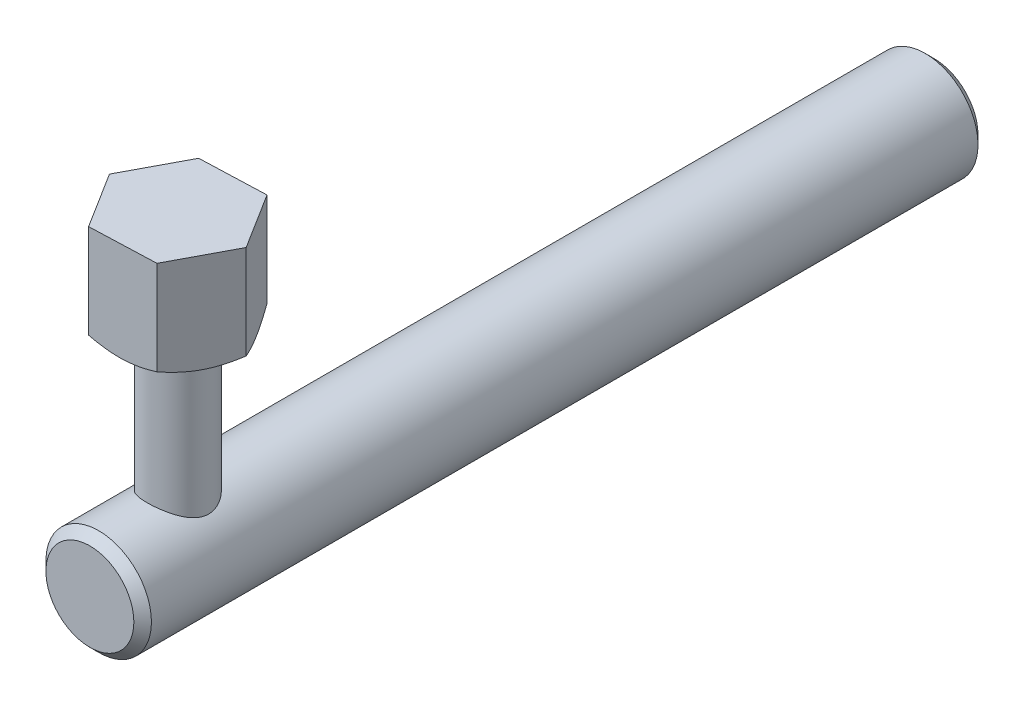
ISO-10303-21;
HEADER;
FILE_DESCRIPTION(('STEP AP214'),'2;1');
FILE_NAME('part.step','',(''),(''),'','','');
FILE_SCHEMA(('AUTOMOTIVE_DESIGN { 1 0 10303 214 1 1 1 1 }'));
ENDSEC;
DATA;
#1=APPLICATION_CONTEXT('core data for automotive mechanical design processes');
#2=APPLICATION_PROTOCOL_DEFINITION('international standard','automotive_design',2000,#1);
#3=PRODUCT_CONTEXT('',#1,'mechanical');
#4=PRODUCT('Part','Part','',(#3));
#5=PRODUCT_RELATED_PRODUCT_CATEGORY('part','',(#4));
#6=PRODUCT_DEFINITION_FORMATION('','',#4);
#7=PRODUCT_DEFINITION_CONTEXT('part definition',#1,'design');
#8=PRODUCT_DEFINITION('design','',#6,#7);
#9=PRODUCT_DEFINITION_SHAPE('','',#8);
#10=(LENGTH_UNIT() NAMED_UNIT(*) SI_UNIT(.MILLI.,.METRE.));
#11=(NAMED_UNIT(*) PLANE_ANGLE_UNIT() SI_UNIT($,.RADIAN.));
#12=(NAMED_UNIT(*) SI_UNIT($,.STERADIAN.) SOLID_ANGLE_UNIT());
#13=UNCERTAINTY_MEASURE_WITH_UNIT(LENGTH_MEASURE(1.E-05),#10,'distance_accuracy_value','');
#14=(GEOMETRIC_REPRESENTATION_CONTEXT(3) GLOBAL_UNCERTAINTY_ASSIGNED_CONTEXT((#13)) GLOBAL_UNIT_ASSIGNED_CONTEXT((#10,
#11,#12)) REPRESENTATION_CONTEXT('',''));
#15=CARTESIAN_POINT('',(0.,0.,0.));
#16=DIRECTION('',(0.,0.,1.));
#17=DIRECTION('',(1.,0.,0.));
#18=AXIS2_PLACEMENT_3D('',#15,#16,#17);
#19=CARTESIAN_POINT('',(0.,0.,48.));
#20=DIRECTION('',(0.,0.,-1.));
#21=DIRECTION('',(-1.,0.,0.));
#22=AXIS2_PLACEMENT_3D('',#19,#20,#21);
#23=CYLINDRICAL_SURFACE('',#22,3.);
#24=CARTESIAN_POINT('',(0.,0.,0.500000000000007));
#25=DIRECTION('',(0.,0.,1.));
#26=DIRECTION('',(1.,0.,0.));
#27=AXIS2_PLACEMENT_3D('',#24,#25,#26);
#28=CIRCLE('',#27,3.);
#29=CARTESIAN_POINT('',(3.,0.,0.500000000000007));
#30=VERTEX_POINT('',#29);
#31=EDGE_CURVE('E158',#30,#30,#28,.T.);
#32=ORIENTED_EDGE('',*,*,#31,.T.);
#33=EDGE_LOOP('',(#32));
#34=FACE_BOUND('',#33,.T.);
#35=CARTESIAN_POINT('',(0.,0.,47.5));
#36=DIRECTION('',(0.,0.,1.));
#37=DIRECTION('',(1.,0.,0.));
#38=AXIS2_PLACEMENT_3D('',#35,#36,#37);
#39=CIRCLE('',#38,3.);
#40=CARTESIAN_POINT('',(3.,0.,47.5));
#41=VERTEX_POINT('',#40);
#42=EDGE_CURVE('E90',#41,#41,#39,.F.);
#43=ORIENTED_EDGE('',*,*,#42,.T.);
#44=EDGE_LOOP('',(#43));
#45=FACE_BOUND('',#44,.T.);
#46=CARTESIAN_POINT('',(0.,3.,41.25));
#47=CARTESIAN_POINT('',(-0.0899260943450845,2.99999338722546,41.2500075102751));
#48=CARTESIAN_POINT('',(-0.179998893749567,2.99591170123809,41.2569801261747));
#49=CARTESIAN_POINT('',(-0.357477608462208,2.97996641346643,41.2845347706795));
#50=CARTESIAN_POINT('',(-0.444875348469012,2.96808104977951,41.3051548589132));
#51=CARTESIAN_POINT('',(-0.614025151526458,2.93774064644758,41.3588700314015));
#52=CARTESIAN_POINT('',(-0.695802763517555,2.91931806060852,41.3919035366462));
#53=CARTESIAN_POINT('',(-0.852413327579683,2.87749372937535,41.4691433051688));
#54=CARTESIAN_POINT('',(-0.927248639202856,2.85409368469238,41.5133457531799));
#55=CARTESIAN_POINT('',(-1.07412994865769,2.80227568751607,41.6153261901825));
#56=CARTESIAN_POINT('',(-1.14555876319282,2.7736144392163,41.6738672112658));
#57=CARTESIAN_POINT('',(-1.2781872761086,2.71505162558485,41.8011664198337));
#58=CARTESIAN_POINT('',(-1.33937410327363,2.68514855764821,41.869937261385));
#59=CARTESIAN_POINT('',(-1.45686356139007,2.62343929807139,42.0250291391928));
#60=CARTESIAN_POINT('',(-1.51180708165682,2.59180663266207,42.1124578489916));
#61=CARTESIAN_POINT('',(-1.60599469056331,2.53452851602359,42.2971609938009));
#62=CARTESIAN_POINT('',(-1.64526337520153,2.50887371124403,42.3944197012085));
#63=CARTESIAN_POINT('',(-1.69909798826494,2.4726236141756,42.5731886725813));
#64=CARTESIAN_POINT('',(-1.71726593207437,2.45992290524076,42.6531861262229));
#65=CARTESIAN_POINT('',(-1.74220880806771,2.44232499742875,42.8157446129059));
#66=CARTESIAN_POINT('',(-1.74899672707175,2.4374189037159,42.8983026140835));
#67=CARTESIAN_POINT('',(-1.75079751335569,2.43612603576165,43.0637461686225));
#68=CARTESIAN_POINT('',(-1.74579159193087,2.43975285524638,43.1466320343467));
#69=CARTESIAN_POINT('',(-1.72427221835426,2.4550052736622,43.3101580332378));
#70=CARTESIAN_POINT('',(-1.70775053579179,2.46663659340118,43.390796517287));
#71=CARTESIAN_POINT('',(-1.66420416251994,2.49621759524857,43.5472449281548));
#72=CARTESIAN_POINT('',(-1.63725766204425,2.51412014830033,43.6230860226689));
#73=CARTESIAN_POINT('',(-1.57381751458139,2.55431118840021,43.7693924210053));
#74=CARTESIAN_POINT('',(-1.53732027653726,2.57660132438734,43.8398556898772));
#75=CARTESIAN_POINT('',(-1.44880386712598,2.62754339459873,43.9858591479175));
#76=CARTESIAN_POINT('',(-1.39521241489436,2.65663674082645,44.0602930726072));
#77=CARTESIAN_POINT('',(-1.27719426081561,2.71535009643278,44.1998490854684));
#78=CARTESIAN_POINT('',(-1.21275783328052,2.74497055700983,44.2649627174144));
#79=CARTESIAN_POINT('',(-1.06533337749026,2.80573975117747,44.3921838607443));
#80=CARTESIAN_POINT('',(-0.981035653023088,2.83662238285853,44.4529168874777));
#81=CARTESIAN_POINT('',(-0.801536482279148,2.89246450838123,44.5591316856122));
#82=CARTESIAN_POINT('',(-0.706341603399296,2.91742754221545,44.6046225787535));
#83=CARTESIAN_POINT('',(-0.514251102271482,2.9571107689339,44.6756525193109));
#84=CARTESIAN_POINT('',(-0.417897866948717,2.97240570101994,44.7023251922613));
#85=CARTESIAN_POINT('',(-0.221075458285349,2.99347337655184,44.7388538422154));
#86=CARTESIAN_POINT('',(-0.12061080958467,2.99925631377851,44.7487278223727));
#87=CARTESIAN_POINT('',(0.067717403990929,3.00052359526908,44.7508952195566));
#88=CARTESIAN_POINT('',(0.155557082863695,2.99722519897386,44.7452665679397));
#89=CARTESIAN_POINT('',(0.328810809400083,2.98319182205348,44.7210553653368));
#90=CARTESIAN_POINT('',(0.41422484902943,2.97245681679956,44.7024727714496));
#91=CARTESIAN_POINT('',(0.579031092089089,2.94475908509854,44.6536327433821));
#92=CARTESIAN_POINT('',(0.658496978005276,2.92789716062394,44.6235638954467));
#93=CARTESIAN_POINT('',(0.811280788568504,2.88929746572665,44.5528733099519));
#94=CARTESIAN_POINT('',(0.884597345554283,2.86755861456527,44.5122492330122));
#95=CARTESIAN_POINT('',(1.03125054777328,2.81835251812347,44.4168466193152));
#96=CARTESIAN_POINT('',(1.1037917379709,2.79052428902397,44.361033709639));
#97=CARTESIAN_POINT('',(1.23903994969308,2.73316466994081,44.2391854559716));
#98=CARTESIAN_POINT('',(1.30173536781871,2.70363132566081,44.1731382300313));
#99=CARTESIAN_POINT('',(1.42318031383413,2.64191747712639,44.0234394393859));
#100=CARTESIAN_POINT('',(1.4805627405233,2.6098424416357,43.9386273020232));
#101=CARTESIAN_POINT('',(1.58019412669645,2.55075513818308,43.7589496391092));
#102=CARTESIAN_POINT('',(1.62246174572416,2.52373664759979,43.6640966980315));
#103=CARTESIAN_POINT('',(1.68265714440949,2.48388372009225,43.4877261025337));
#104=CARTESIAN_POINT('',(1.70386706375961,2.46924743843143,43.4077388924777));
#105=CARTESIAN_POINT('',(1.73480246090685,2.44761658997012,43.2446045317072));
#106=CARTESIAN_POINT('',(1.74454222628975,2.44061251706413,43.1614614456635));
#107=CARTESIAN_POINT('',(1.75199797784208,2.43526756986959,42.9941233924334));
#108=CARTESIAN_POINT('',(1.74968171574835,2.43694993053426,42.9099262056538));
#109=CARTESIAN_POINT('',(1.73309765744759,2.44876883220608,42.7433060808237));
#110=CARTESIAN_POINT('',(1.71882257779048,2.45891052530542,42.6608842554328));
#111=CARTESIAN_POINT('',(1.67969834968853,2.48578933414961,42.5024193598982));
#112=CARTESIAN_POINT('',(1.6551721029676,2.50232397669437,42.4262600387955));
#113=CARTESIAN_POINT('',(1.59654281469426,2.54013079252814,42.2790005665599));
#114=CARTESIAN_POINT('',(1.56243614711979,2.56140475893648,42.2079023437599));
#115=CARTESIAN_POINT('',(1.47952471389623,2.61029903994167,42.0610224449251));
#116=CARTESIAN_POINT('',(1.42926140154465,2.63839194619498,41.9862219348996));
#117=CARTESIAN_POINT('',(1.31811740411898,2.69564120997005,41.8453893283888));
#118=CARTESIAN_POINT('',(1.25722839803791,2.72479838666695,41.7793641758257));
#119=CARTESIAN_POINT('',(1.11644726620308,2.78571532241789,41.6485122738925));
#120=CARTESIAN_POINT('',(1.03508780981761,2.81726705078823,41.5851506195222));
#121=CARTESIAN_POINT('',(0.861137847178947,2.87521292497644,41.4730254125696));
#122=CARTESIAN_POINT('',(0.768544713403451,2.9016058603848,41.4242652845244));
#123=CARTESIAN_POINT('',(0.578904287064569,2.94513750992323,41.3455009884513));
#124=CARTESIAN_POINT('',(0.482276584546067,2.9626557940663,41.3147168828241));
#125=CARTESIAN_POINT('',(0.333826312006086,2.98178935898444,41.2813839255705));
#126=CARTESIAN_POINT('',(0.28381647122351,2.98697473272503,41.272416377112));
#127=CARTESIAN_POINT('',(0.183023149242705,2.99483609603923,41.2588575187579));
#128=CARTESIAN_POINT('',(0.132240341083978,2.99751415451088,41.2542626007576));
#129=CARTESIAN_POINT('',(0.0542562694068423,2.99963295339894,41.2506296437925));
#130=CARTESIAN_POINT('',(0.0271348134861308,3.00000199537637,41.2499977338067));
#131=CARTESIAN_POINT('',(0.,3.,41.25));
#132=B_SPLINE_CURVE_WITH_KNOTS('',3,(#46,#47,#48,#49,#50,#51,#52,#53,#54,#55,#56,#57,#58,#59,
#60,#61,#62,#63,#64,#65,#66,#67,#68,#69,#70,#71,#72,#73,#74,#75,#76,#77,#78,#79,#80,#81,#82,#83,
#84,#85,#86,#87,#88,#89,#90,#91,#92,#93,#94,#95,#96,#97,#98,#99,#100,#101,#102,#103,#104,#105,
#106,#107,#108,#109,#110,#111,#112,#113,#114,#115,#116,#117,#118,#119,#120,#121,#122,#123,#124,
#125,#126,#127,#128,#129,#130,#131),.UNSPECIFIED.,.T.,.F.,(4,2,2,2,2,2,2,2,2,2,2,2,2,2,2,2,2,2,
2,2,2,2,2,2,2,2,2,2,2,2,2,2,2,2,2,2,2,2,2,2,2,2,4),(0.,0.269682848507375,0.540120966746718,
0.809234867445783,1.07825696388483,1.36720562389127,1.65651472601918,1.97891442487773,
2.30080622610211,2.54877444581718,2.79645949249157,3.04453939165373,3.29279677764287,
3.53922714819382,3.78575030950587,4.07329505075291,4.36109904743875,4.6845988301423,
5.00790466534685,5.30952425878853,5.61082040251298,5.87376281934726,6.13670610700591,
6.39550593899182,6.65436317839365,6.94021883480414,7.22640888861097,7.54680260063234,
7.86679940325803,8.11784613873921,8.36857983060696,8.61998454570948,8.87154248884005,
9.11571156496426,9.35997317962995,9.64208079618314,9.92441033147709,10.246312237478,
10.5682895810184,10.8749947772205,11.0280026433255,11.1808841442313,11.26225978773),.UNSPECIFIED.);
#133=CARTESIAN_POINT('',(0.,3.,41.25));
#134=VERTEX_POINT('',#133);
#135=EDGE_CURVE('E91',#134,#134,#132,.T.);
#136=ORIENTED_EDGE('',*,*,#135,.F.);
#137=EDGE_LOOP('',(#136));
#138=FACE_BOUND('',#137,.T.);
#139=ADVANCED_FACE('F31',(#34,#45,#138),#23,.T.);
#140=CARTESIAN_POINT('',(0.,0.,48.));
#141=DIRECTION('',(0.,0.,1.));
#142=DIRECTION('',(1.,0.,0.));
#143=AXIS2_PLACEMENT_3D('',#140,#141,#142);
#144=PLANE('',#143);
#145=CARTESIAN_POINT('',(0.,0.,48.));
#146=DIRECTION('',(0.,0.,1.));
#147=DIRECTION('',(1.,0.,0.));
#148=AXIS2_PLACEMENT_3D('',#145,#146,#147);
#149=CIRCLE('',#148,2.50000000000001);
#150=CARTESIAN_POINT('',(2.50000000000001,0.,48.));
#151=VERTEX_POINT('',#150);
#152=EDGE_CURVE('E11',#151,#151,#149,.T.);
#153=ORIENTED_EDGE('',*,*,#152,.T.);
#154=EDGE_LOOP('',(#153));
#155=FACE_BOUND('',#154,.T.);
#156=ADVANCED_FACE('F143',(#155),#144,.T.);
#157=CARTESIAN_POINT('',(0.,0.,0.));
#158=DIRECTION('',(0.,0.,1.));
#159=DIRECTION('',(1.,0.,0.));
#160=AXIS2_PLACEMENT_3D('',#157,#158,#159);
#161=PLANE('',#160);
#162=CARTESIAN_POINT('',(0.,0.,0.));
#163=DIRECTION('',(0.,0.,1.));
#164=DIRECTION('',(1.,0.,0.));
#165=AXIS2_PLACEMENT_3D('',#162,#163,#164);
#166=CIRCLE('',#165,2.5);
#167=CARTESIAN_POINT('',(2.5,0.,0.));
#168=VERTEX_POINT('',#167);
#169=EDGE_CURVE('E39',#168,#168,#166,.F.);
#170=ORIENTED_EDGE('',*,*,#169,.T.);
#171=EDGE_LOOP('',(#170));
#172=FACE_BOUND('',#171,.T.);
#173=ADVANCED_FACE('F138',(#172),#161,.F.);
#174=CARTESIAN_POINT('',(0.,10.,43.));
#175=DIRECTION('',(0.,-1.,0.));
#176=DIRECTION('',(0.,0.,-1.));
#177=AXIS2_PLACEMENT_3D('',#174,#175,#176);
#178=CYLINDRICAL_SURFACE('',#177,1.75);
#179=CARTESIAN_POINT('',(0.,10.,43.));
#180=DIRECTION('',(0.,1.,0.));
#181=DIRECTION('',(0.,0.,1.));
#182=AXIS2_PLACEMENT_3D('',#179,#180,#181);
#183=CIRCLE('',#182,1.75);
#184=CARTESIAN_POINT('',(0.,10.,44.75));
#185=VERTEX_POINT('',#184);
#186=EDGE_CURVE('E102',#185,#185,#183,.T.);
#187=ORIENTED_EDGE('',*,*,#186,.F.);
#188=EDGE_LOOP('',(#187));
#189=FACE_BOUND('',#188,.T.);
#190=ORIENTED_EDGE('',*,*,#135,.T.);
#191=EDGE_LOOP('',(#190));
#192=FACE_BOUND('',#191,.T.);
#193=ADVANCED_FACE('F133',(#189,#192),#178,.T.);
#194=CARTESIAN_POINT('',(0.,10.,43.));
#195=DIRECTION('',(0.,1.,0.));
#196=DIRECTION('',(0.,0.,1.));
#197=AXIS2_PLACEMENT_3D('',#194,#195,#196);
#198=CONICAL_SURFACE('',#197,1.75,1.0471975511966);
#199=ORIENTED_EDGE('',*,*,#186,.T.);
#200=EDGE_LOOP('',(#199));
#201=FACE_BOUND('',#200,.T.);
#202=CARTESIAN_POINT('',(3.7504066221204,11.1563718453863,42.8633637550206));
#203=CARTESIAN_POINT('',(3.66279591393919,11.1087465089926,42.7236440962043));
#204=CARTESIAN_POINT('',(3.57442895604172,11.0654329032158,42.5827183867289));
#205=CARTESIAN_POINT('',(3.39616485296428,10.9898283431835,42.2984266582604));
#206=CARTESIAN_POINT('',(3.3062645401293,10.9575641354304,42.1550555875597));
#207=CARTESIAN_POINT('',(3.12757806752451,10.9073398855258,41.8700902733221));
#208=CARTESIAN_POINT('',(3.03881940187538,10.8890455796959,41.728539876813));
#209=CARTESIAN_POINT('',(2.86088440086257,10.8672054401073,41.4447729931854));
#210=CARTESIAN_POINT('',(2.77170871230497,10.863641521401,41.302557537579));
#211=CARTESIAN_POINT('',(2.60507697513266,10.8710531404543,41.0368168541738));
#212=CARTESIAN_POINT('',(2.52759599059848,10.8802088735679,40.9132518591109));
#213=CARTESIAN_POINT('',(2.37313881298929,10.9092279710964,40.6669268994649));
#214=CARTESIAN_POINT('',(2.29616315420756,10.9291012498247,40.5441677869612));
#215=CARTESIAN_POINT('',(2.14138747903203,10.9787832230896,40.2973348942985));
#216=CARTESIAN_POINT('',(2.06360705337839,11.0088025316205,40.1732923570273));
#217=CARTESIAN_POINT('',(1.90920632288802,11.0769346775788,39.9270574180232));
#218=CARTESIAN_POINT('',(1.83258403973161,11.1150315048238,39.8048618613088));
#219=CARTESIAN_POINT('',(1.75651153283148,11.1563718453863,39.6835430758539));
#220=B_SPLINE_CURVE_WITH_KNOTS('',3,(#202,#203,#204,#205,#206,#207,#208,#209,#210,#211,#212,
#213,#214,#215,#216,#217,#218,#219),.UNSPECIFIED.,.F.,.F.,(4,2,2,2,2,2,2,2,4),(0.,
0.515167182529291,1.03157272281126,1.53519724939805,2.03820327671983,2.47619144736974,
2.91458547765286,3.36270420986569,3.80994290792929),.UNSPECIFIED.);
#221=CARTESIAN_POINT('',(3.75028121284168,11.1563036955848,42.8631637550206));
#222=VERTEX_POINT('',#221);
#223=CARTESIAN_POINT('',(1.75663694211021,11.1563036955848,39.6837430758539));
#224=VERTEX_POINT('',#223);
#225=EDGE_CURVE('E82',#222,#224,#220,.T.);
#226=ORIENTED_EDGE('',*,*,#225,.F.);
#227=CARTESIAN_POINT('',(1.99353832978767,11.1563690332446,46.1796206791667));
#228=CARTESIAN_POINT('',(2.07073367268943,11.1087439278033,46.033887896101));
#229=CARTESIAN_POINT('',(2.14859536074791,11.0654305673381,45.8868971571726));
#230=CARTESIAN_POINT('',(2.30566700564657,10.9898265164491,45.5903703578691));
#231=CARTESIAN_POINT('',(2.38487975351698,10.9575625722074,45.4408290284637));
#232=CARTESIAN_POINT('',(2.54232355169433,10.9073388432448,45.1435996617385));
#233=CARTESIAN_POINT('',(2.62053037676062,10.8890447964349,44.9959573578996));
#234=CARTESIAN_POINT('',(2.77731203399823,10.8672051574843,44.6999780101303));
#235=CARTESIAN_POINT('',(2.85588629627569,10.8636414806077,44.5516420420706));
#236=CARTESIAN_POINT('',(3.00270783970964,10.8710534818906,44.2744658377254));
#237=CARTESIAN_POINT('',(3.07097709474181,10.8802092618219,44.1455841181854));
#238=CARTESIAN_POINT('',(3.20707082912443,10.9092282326162,43.8886603463119));
#239=CARTESIAN_POINT('',(3.27489483772076,10.9291013372889,43.7606191826889));
#240=CARTESIAN_POINT('',(3.41126919248099,10.9787827671983,43.5031656432533));
#241=CARTESIAN_POINT('',(3.47980227747735,11.0088016994371,43.3737858538364));
#242=CARTESIAN_POINT('',(3.61584626693854,11.0769329498279,43.116955992626));
#243=CARTESIAN_POINT('',(3.68335891445489,11.115029258508,42.9895026302229));
#244=CARTESIAN_POINT('',(3.75038715378547,11.1563690332446,42.8629637550206));
#245=B_SPLINE_CURVE_WITH_KNOTS('',3,(#227,#228,#229,#230,#231,#232,#233,#234,#235,#236,#237,
#238,#239,#240,#241,#242,#243,#244),.UNSPECIFIED.,.F.,.F.,(4,2,2,2,2,2,2,2,4),(0.,
0.515166515548207,1.03157137058384,1.53519529391929,2.03820072526884,2.4761845853491,
2.91457428880859,3.36268846522177,3.80992263980002),.UNSPECIFIED.);
#246=CARTESIAN_POINT('',(1.99364427073147,11.1563036955848,46.1794206791667));
#247=VERTEX_POINT('',#246);
#248=EDGE_CURVE('E85',#247,#222,#245,.T.);
#249=ORIENTED_EDGE('',*,*,#248,.F.);
#250=CARTESIAN_POINT('',(-1.75683694211023,11.1563614713408,46.3162642215319));
#251=CARTESIAN_POINT('',(-1.59203142012176,11.1087369869403,46.3102509741244));
#252=CARTESIAN_POINT('',(-1.42580330665787,11.0654242861288,46.3041858207224));
#253=CARTESIAN_POINT('',(-1.09046867600877,10.989821604347,46.2919504898058));
#254=CARTESIAN_POINT('',(-0.921356200477637,10.9575583686979,46.2857800948894));
#255=CARTESIAN_POINT('',(-0.585227076901218,10.9073360405683,46.2735157753655));
#256=CARTESIAN_POINT('',(-0.41826214588639,10.8890426902729,46.2674237377538));
#257=CARTESIAN_POINT('',(-0.0835466718539181,10.8672043975549,46.2552109979608));
#258=CARTESIAN_POINT('',(0.0842026545942235,10.8636413709662,46.2490903401684));
#259=CARTESIAN_POINT('',(0.397650636509872,10.8710544000583,46.2376535858538));
#260=CARTESIAN_POINT('',(0.543396218100842,10.8802103058707,46.2323357771415));
#261=CARTESIAN_POINT('',(0.833937851512861,10.9092289358558,46.2217348051424));
#262=CARTESIAN_POINT('',(0.978732898435098,10.9291015724845,46.2164516785212));
#263=CARTESIAN_POINT('',(1.26987355535467,10.9787815412943,46.2058288499938));
#264=CARTESIAN_POINT('',(1.41618231754873,11.0087994616765,46.2004904925507));
#265=CARTESIAN_POINT('',(1.70661770172968,11.0769283038707,46.1898933972597));
#266=CARTESIAN_POINT('',(1.85074804451967,11.115023218121,46.1846345236511));
#267=CARTESIAN_POINT('',(1.99384427073147,11.1563614713408,46.1794133817809));
#268=B_SPLINE_CURVE_WITH_KNOTS('',3,(#250,#251,#252,#253,#254,#255,#256,#257,#258,#259,#260,
#261,#262,#263,#264,#265,#266,#267),.UNSPECIFIED.,.F.,.F.,(4,2,2,2,2,2,2,2,4),(0.,
0.515164722022353,1.03156773441653,1.53519003559768,2.03819386436646,2.47616613314565,
2.91454420159842,3.36264612729435,3.80986813804616),.UNSPECIFIED.);
#269=CARTESIAN_POINT('',(-1.75663694211023,11.1563036955848,46.3162569241461));
#270=VERTEX_POINT('',#269);
#271=EDGE_CURVE('E101',#270,#247,#268,.T.);
#272=ORIENTED_EDGE('',*,*,#271,.F.);
#273=CARTESIAN_POINT('',(-3.75040662212041,11.1563718453864,43.1366362449794));
#274=CARTESIAN_POINT('',(-3.66279591393921,11.1087465089927,43.2763559037958));
#275=CARTESIAN_POINT('',(-3.57442895604173,11.0654329032158,43.4172816132711));
#276=CARTESIAN_POINT('',(-3.39616485296429,10.9898283431835,43.7015733417396));
#277=CARTESIAN_POINT('',(-3.30626454012932,10.9575641354304,43.8449444124403));
#278=CARTESIAN_POINT('',(-3.12757806752452,10.9073398855259,44.1299097266779));
#279=CARTESIAN_POINT('',(-3.0388194018754,10.8890455796959,44.271460123187));
#280=CARTESIAN_POINT('',(-2.86088440086259,10.8672054401073,44.5552270068147));
#281=CARTESIAN_POINT('',(-2.77170871230498,10.863641521401,44.697442462421));
#282=CARTESIAN_POINT('',(-2.60507697513267,10.8710531404543,44.9631831458262));
#283=CARTESIAN_POINT('',(-2.52759599059849,10.8802088735679,45.0867481408891));
#284=CARTESIAN_POINT('',(-2.3731388129893,10.9092279710964,45.3330731005351));
#285=CARTESIAN_POINT('',(-2.29616315420757,10.9291012498247,45.4558322130388));
#286=CARTESIAN_POINT('',(-2.14138747903203,10.9787832230896,45.7026651057015));
#287=CARTESIAN_POINT('',(-2.0636070533784,11.0088025316205,45.8267076429727));
#288=CARTESIAN_POINT('',(-1.90920632288803,11.0769346775788,46.0729425819768));
#289=CARTESIAN_POINT('',(-1.83258403973163,11.1150315048238,46.1951381386912));
#290=CARTESIAN_POINT('',(-1.7565115328315,11.1563718453864,46.3164569241461));
#291=B_SPLINE_CURVE_WITH_KNOTS('',3,(#273,#274,#275,#276,#277,#278,#279,#280,#281,#282,#283,
#284,#285,#286,#287,#288,#289,#290),.UNSPECIFIED.,.F.,.F.,(4,2,2,2,2,2,2,2,4),(0.,
0.515167182529291,1.03157272281126,1.53519724939805,2.03820327671984,2.47619144736975,
2.91458547765286,3.36270420986569,3.80994290792928),.UNSPECIFIED.);
#292=CARTESIAN_POINT('',(-3.75028121284169,11.1563036955848,43.1368362449794));
#293=VERTEX_POINT('',#292);
#294=EDGE_CURVE('E207',#293,#270,#291,.T.);
#295=ORIENTED_EDGE('',*,*,#294,.F.);
#296=CARTESIAN_POINT('',(-1.99353832978767,11.1563690332446,39.8203793208333));
#297=CARTESIAN_POINT('',(-2.07073367268944,11.1087439278033,39.966112103899));
#298=CARTESIAN_POINT('',(-2.14859536074792,11.0654305673382,40.1131028428274));
#299=CARTESIAN_POINT('',(-2.30566700564658,10.9898265164491,40.4096296421309));
#300=CARTESIAN_POINT('',(-2.38487975351699,10.9575625722074,40.5591709715363));
#301=CARTESIAN_POINT('',(-2.54232355169434,10.9073388432448,40.8564003382615));
#302=CARTESIAN_POINT('',(-2.62053037676063,10.8890447964349,41.0040426421004));
#303=CARTESIAN_POINT('',(-2.77731203399824,10.8672051574843,41.3000219898697));
#304=CARTESIAN_POINT('',(-2.8558862962757,10.8636414806077,41.4483579579294));
#305=CARTESIAN_POINT('',(-3.00270783970965,10.8710534818906,41.7255341622746));
#306=CARTESIAN_POINT('',(-3.07097709474182,10.8802092618219,41.8544158818146));
#307=CARTESIAN_POINT('',(-3.20707082912444,10.9092282326162,42.1113396536881));
#308=CARTESIAN_POINT('',(-3.27489483772077,10.929101337289,42.2393808173111));
#309=CARTESIAN_POINT('',(-3.411269192481,10.9787827671983,42.4968343567467));
#310=CARTESIAN_POINT('',(-3.47980227747736,11.0088016994371,42.6262141461637));
#311=CARTESIAN_POINT('',(-3.61584626693855,11.0769329498279,42.883044007374));
#312=CARTESIAN_POINT('',(-3.6833589144549,11.115029258508,43.0104973697771));
#313=CARTESIAN_POINT('',(-3.75038715378548,11.1563690332446,43.1370362449794));
#314=B_SPLINE_CURVE_WITH_KNOTS('',3,(#296,#297,#298,#299,#300,#301,#302,#303,#304,#305,#306,
#307,#308,#309,#310,#311,#312,#313),.UNSPECIFIED.,.F.,.F.,(4,2,2,2,2,2,2,2,4),(0.,
0.515166515548206,1.03157137058384,1.53519529391929,2.03820072526884,2.4761845853491,
2.91457428880859,3.36268846522177,3.80992263980003),.UNSPECIFIED.);
#315=CARTESIAN_POINT('',(-1.99364427073147,11.1563036955848,39.8205793208333));
#316=VERTEX_POINT('',#315);
#317=EDGE_CURVE('E189',#316,#293,#314,.T.);
#318=ORIENTED_EDGE('',*,*,#317,.F.);
#319=CARTESIAN_POINT('',(1.75683694211021,11.1563614713408,39.6837357784681));
#320=CARTESIAN_POINT('',(1.59203142012174,11.1087369869403,39.6897490258756));
#321=CARTESIAN_POINT('',(1.42580330665786,11.0654242861288,39.6958141792776));
#322=CARTESIAN_POINT('',(1.09046867600876,10.989821604347,39.7080495101942));
#323=CARTESIAN_POINT('',(0.921356200477623,10.9575583686979,39.7142199051107));
#324=CARTESIAN_POINT('',(0.585227076901204,10.9073360405683,39.7264842246345));
#325=CARTESIAN_POINT('',(0.418262145886376,10.8890426902729,39.7325762622462));
#326=CARTESIAN_POINT('',(0.083546671853905,10.8672043975549,39.7447890020392));
#327=CARTESIAN_POINT('',(-0.084202654594236,10.8636413709662,39.7509096598316));
#328=CARTESIAN_POINT('',(-0.397650636509883,10.8710544000583,39.7623464141462));
#329=CARTESIAN_POINT('',(-0.543396218100854,10.8802103058707,39.7676642228585));
#330=CARTESIAN_POINT('',(-0.833937851512872,10.9092289358558,39.7782651948576));
#331=CARTESIAN_POINT('',(-0.978732898435108,10.9291015724846,39.7835483214788));
#332=CARTESIAN_POINT('',(-1.26987355535468,10.9787815412943,39.7941711500062));
#333=CARTESIAN_POINT('',(-1.41618231754873,11.0087994616765,39.7995095074493));
#334=CARTESIAN_POINT('',(-1.70661770172969,11.0769283038707,39.8101066027403));
#335=CARTESIAN_POINT('',(-1.85074804451968,11.115023218121,39.8153654763489));
#336=CARTESIAN_POINT('',(-1.99384427073147,11.1563614713408,39.8205866182191));
#337=B_SPLINE_CURVE_WITH_KNOTS('',3,(#319,#320,#321,#322,#323,#324,#325,#326,#327,#328,#329,
#330,#331,#332,#333,#334,#335,#336),.UNSPECIFIED.,.F.,.F.,(4,2,2,2,2,2,2,2,4),(0.,
0.51516472202235,1.03156773441652,1.53519003559767,2.03819386436645,2.47616613314564,
2.91454420159841,3.36264612729435,3.80986813804615),.UNSPECIFIED.);
#338=EDGE_CURVE('E46',#224,#316,#337,.T.);
#339=ORIENTED_EDGE('',*,*,#338,.F.);
#340=EDGE_LOOP('',(#226,#249,#272,#295,#318,#339));
#341=FACE_BOUND('',#340,.T.);
#342=ADVANCED_FACE('F84',(#201,#341),#198,.T.);
#343=CARTESIAN_POINT('',(-1.99364427073147,16.5,39.8205793208333));
#344=DIRECTION('',(0.,1.,0.));
#345=DIRECTION('',(0.,0.,1.));
#346=AXIS2_PLACEMENT_3D('',#343,#344,#345);
#347=PLANE('',#346);
#348=DIRECTION('',(-0.999335015894281,0.,0.0364626659417306));
#349=VECTOR('',#348,1.);
#350=CARTESIAN_POINT('',(1.75663694211021,16.5,39.6837430758539));
#351=LINE('',#350,#349);
#352=CARTESIAN_POINT('',(1.75663694211021,16.5,39.6837430758539));
#353=VERTEX_POINT('',#352);
#354=CARTESIAN_POINT('',(-1.99364427073147,16.5,39.8205793208333));
#355=VERTEX_POINT('',#354);
#356=EDGE_CURVE('E184',#353,#355,#351,.T.);
#357=ORIENTED_EDGE('',*,*,#356,.T.);
#358=DIRECTION('',(-0.468089912951894,0.,0.883680843626639));
#359=VECTOR('',#358,1.);
#360=CARTESIAN_POINT('',(-1.99364427073147,16.5,39.8205793208333));
#361=LINE('',#360,#359);
#362=CARTESIAN_POINT('',(-3.75028121284169,16.5,43.1368362449794));
#363=VERTEX_POINT('',#362);
#364=EDGE_CURVE('E185',#355,#363,#361,.T.);
#365=ORIENTED_EDGE('',*,*,#364,.T.);
#366=DIRECTION('',(0.531245102942386,0.,0.847218177684906));
#367=VECTOR('',#366,1.);
#368=CARTESIAN_POINT('',(-3.75028121284169,16.5,43.1368362449794));
#369=LINE('',#368,#367);
#370=CARTESIAN_POINT('',(-1.75663694211023,16.5,46.3162569241461));
#371=VERTEX_POINT('',#370);
#372=EDGE_CURVE('E187',#363,#371,#369,.T.);
#373=ORIENTED_EDGE('',*,*,#372,.T.);
#374=DIRECTION('',(0.99933501589428,0.,-0.0364626659417305));
#375=VECTOR('',#374,1.);
#376=CARTESIAN_POINT('',(-1.75663694211023,16.5,46.3162569241461));
#377=LINE('',#376,#375);
#378=CARTESIAN_POINT('',(1.99364427073147,16.5,46.1794206791667));
#379=VERTEX_POINT('',#378);
#380=EDGE_CURVE('E197',#371,#379,#377,.T.);
#381=ORIENTED_EDGE('',*,*,#380,.T.);
#382=DIRECTION('',(0.468089912951894,0.,-0.883680843626639));
#383=VECTOR('',#382,1.);
#384=CARTESIAN_POINT('',(1.99364427073147,16.5,46.1794206791667));
#385=LINE('',#384,#383);
#386=CARTESIAN_POINT('',(3.75028121284168,16.5,42.8631637550206));
#387=VERTEX_POINT('',#386);
#388=EDGE_CURVE('E199',#379,#387,#385,.T.);
#389=ORIENTED_EDGE('',*,*,#388,.T.);
#390=DIRECTION('',(-0.531245102942386,0.,-0.847218177684906));
#391=VECTOR('',#390,1.);
#392=CARTESIAN_POINT('',(3.75028121284168,16.5,42.8631637550206));
#393=LINE('',#392,#391);
#394=EDGE_CURVE('E54',#387,#353,#393,.T.);
#395=ORIENTED_EDGE('',*,*,#394,.T.);
#396=EDGE_LOOP('',(#357,#365,#373,#381,#389,#395));
#397=FACE_BOUND('',#396,.T.);
#398=ADVANCED_FACE('F200',(#397),#347,.T.);
#399=CARTESIAN_POINT('',(3.75028121284168,16.5,42.8631637550206));
#400=DIRECTION('',(-0.847218177684906,0.,0.531245102942386));
#401=DIRECTION('',(0.531245102942386,0.,0.847218177684906));
#402=AXIS2_PLACEMENT_3D('',#399,#400,#401);
#403=PLANE('',#402);
#404=DIRECTION('',(0.,-1.,0.));
#405=VECTOR('',#404,1.);
#406=CARTESIAN_POINT('',(3.75028121284168,16.5,42.8631637550206));
#407=LINE('',#406,#405);
#408=EDGE_CURVE('E98',#387,#222,#407,.T.);
#409=ORIENTED_EDGE('',*,*,#408,.T.);
#410=ORIENTED_EDGE('',*,*,#225,.T.);
#411=DIRECTION('',(0.,-1.,0.));
#412=VECTOR('',#411,1.);
#413=CARTESIAN_POINT('',(1.75663694211021,16.5,39.6837430758539));
#414=LINE('',#413,#412);
#415=EDGE_CURVE('E105',#353,#224,#414,.T.);
#416=ORIENTED_EDGE('',*,*,#415,.F.);
#417=ORIENTED_EDGE('',*,*,#394,.F.);
#418=EDGE_LOOP('',(#409,#410,#416,#417));
#419=FACE_BOUND('',#418,.T.);
#420=ADVANCED_FACE('F104',(#419),#403,.F.);
#421=CARTESIAN_POINT('',(1.99364427073147,16.5,46.1794206791667));
#422=DIRECTION('',(-0.883680843626639,0.,-0.468089912951894));
#423=DIRECTION('',(-0.468089912951894,0.,0.883680843626639));
#424=AXIS2_PLACEMENT_3D('',#421,#422,#423);
#425=PLANE('',#424);
#426=DIRECTION('',(0.,-1.,0.));
#427=VECTOR('',#426,1.);
#428=CARTESIAN_POINT('',(1.99364427073147,16.5,46.1794206791667));
#429=LINE('',#428,#427);
#430=EDGE_CURVE('E100',#379,#247,#429,.T.);
#431=ORIENTED_EDGE('',*,*,#430,.T.);
#432=ORIENTED_EDGE('',*,*,#248,.T.);
#433=ORIENTED_EDGE('',*,*,#408,.F.);
#434=ORIENTED_EDGE('',*,*,#388,.F.);
#435=EDGE_LOOP('',(#431,#432,#433,#434));
#436=FACE_BOUND('',#435,.T.);
#437=ADVANCED_FACE('F96',(#436),#425,.F.);
#438=CARTESIAN_POINT('',(-1.75663694211023,16.5,46.3162569241461));
#439=DIRECTION('',(-0.0364626659417305,0.,-0.999335015894281));
#440=DIRECTION('',(-0.999335015894281,0.,0.0364626659417305));
#441=AXIS2_PLACEMENT_3D('',#438,#439,#440);
#442=PLANE('',#441);
#443=DIRECTION('',(0.,-1.,0.));
#444=VECTOR('',#443,1.);
#445=CARTESIAN_POINT('',(-1.75663694211023,16.5,46.3162569241461));
#446=LINE('',#445,#444);
#447=EDGE_CURVE('E107',#371,#270,#446,.T.);
#448=ORIENTED_EDGE('',*,*,#447,.T.);
#449=ORIENTED_EDGE('',*,*,#271,.T.);
#450=ORIENTED_EDGE('',*,*,#430,.F.);
#451=ORIENTED_EDGE('',*,*,#380,.F.);
#452=EDGE_LOOP('',(#448,#449,#450,#451));
#453=FACE_BOUND('',#452,.T.);
#454=ADVANCED_FACE('F205',(#453),#442,.F.);
#455=CARTESIAN_POINT('',(-3.75028121284169,16.5,43.1368362449794));
#456=DIRECTION('',(0.847218177684906,0.,-0.531245102942386));
#457=DIRECTION('',(-0.531245102942386,0.,-0.847218177684906));
#458=AXIS2_PLACEMENT_3D('',#455,#456,#457);
#459=PLANE('',#458);
#460=DIRECTION('',(0.,-1.,0.));
#461=VECTOR('',#460,1.);
#462=CARTESIAN_POINT('',(-3.75028121284169,16.5,43.1368362449794));
#463=LINE('',#462,#461);
#464=EDGE_CURVE('E114',#363,#293,#463,.T.);
#465=ORIENTED_EDGE('',*,*,#464,.T.);
#466=ORIENTED_EDGE('',*,*,#294,.T.);
#467=ORIENTED_EDGE('',*,*,#447,.F.);
#468=ORIENTED_EDGE('',*,*,#372,.F.);
#469=EDGE_LOOP('',(#465,#466,#467,#468));
#470=FACE_BOUND('',#469,.T.);
#471=ADVANCED_FACE('F180',(#470),#459,.F.);
#472=CARTESIAN_POINT('',(-1.99364427073147,16.5,39.8205793208333));
#473=DIRECTION('',(0.883680843626639,0.,0.468089912951894));
#474=DIRECTION('',(0.468089912951894,0.,-0.883680843626639));
#475=AXIS2_PLACEMENT_3D('',#472,#473,#474);
#476=PLANE('',#475);
#477=DIRECTION('',(0.,-1.,0.));
#478=VECTOR('',#477,1.);
#479=CARTESIAN_POINT('',(-1.99364427073147,16.5,39.8205793208333));
#480=LINE('',#479,#478);
#481=EDGE_CURVE('E117',#355,#316,#480,.T.);
#482=ORIENTED_EDGE('',*,*,#481,.T.);
#483=ORIENTED_EDGE('',*,*,#317,.T.);
#484=ORIENTED_EDGE('',*,*,#464,.F.);
#485=ORIENTED_EDGE('',*,*,#364,.F.);
#486=EDGE_LOOP('',(#482,#483,#484,#485));
#487=FACE_BOUND('',#486,.T.);
#488=ADVANCED_FACE('F175',(#487),#476,.F.);
#489=CARTESIAN_POINT('',(1.75663694211021,16.5,39.6837430758539));
#490=DIRECTION('',(0.0364626659417306,0.,0.99933501589428));
#491=DIRECTION('',(0.99933501589428,0.,-0.0364626659417306));
#492=AXIS2_PLACEMENT_3D('',#489,#490,#491);
#493=PLANE('',#492);
#494=ORIENTED_EDGE('',*,*,#415,.T.);
#495=ORIENTED_EDGE('',*,*,#338,.T.);
#496=ORIENTED_EDGE('',*,*,#481,.F.);
#497=ORIENTED_EDGE('',*,*,#356,.F.);
#498=EDGE_LOOP('',(#494,#495,#496,#497));
#499=FACE_BOUND('',#498,.T.);
#500=ADVANCED_FACE('F140',(#499),#493,.F.);
#501=CARTESIAN_POINT('',(0.,0.,0.500000000000007));
#502=DIRECTION('',(0.,0.,1.));
#503=DIRECTION('',(1.,0.,0.));
#504=AXIS2_PLACEMENT_3D('',#501,#502,#503);
#505=CONICAL_SURFACE('',#504,3.,0.785398163397441);
#506=ORIENTED_EDGE('',*,*,#169,.F.);
#507=EDGE_LOOP('',(#506));
#508=FACE_BOUND('',#507,.T.);
#509=ORIENTED_EDGE('',*,*,#31,.F.);
#510=EDGE_LOOP('',(#509));
#511=FACE_BOUND('',#510,.T.);
#512=ADVANCED_FACE('F168',(#508,#511),#505,.T.);
#513=CARTESIAN_POINT('',(0.,0.,48.));
#514=DIRECTION('',(0.,0.,-1.));
#515=DIRECTION('',(-1.,0.,0.));
#516=AXIS2_PLACEMENT_3D('',#513,#514,#515);
#517=CONICAL_SURFACE('',#516,2.50000000000001,0.785398163397448);
#518=ORIENTED_EDGE('',*,*,#42,.F.);
#519=EDGE_LOOP('',(#518));
#520=FACE_BOUND('',#519,.T.);
#521=ORIENTED_EDGE('',*,*,#152,.F.);
#522=EDGE_LOOP('',(#521));
#523=FACE_BOUND('',#522,.T.);
#524=ADVANCED_FACE('F33',(#520,#523),#517,.T.);
#525=CLOSED_SHELL('',(#139,#156,#173,#193,#342,#398,#420,#437,#454,#471,#488,#500,#512,#524));
#526=MANIFOLD_SOLID_BREP('B2',#525);
#527=ADVANCED_BREP_SHAPE_REPRESENTATION('',(#18,#526),#14);
#528=SHAPE_DEFINITION_REPRESENTATION(#9,#527);
ENDSEC;
END-ISO-10303-21;
